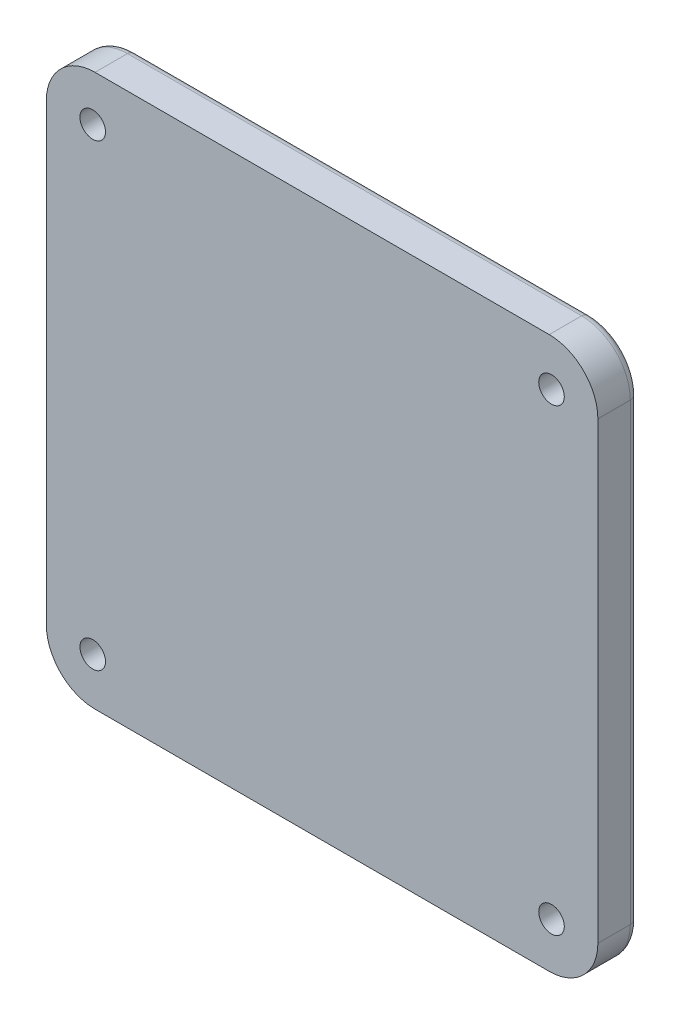
ISO-10303-21;
HEADER;
FILE_DESCRIPTION(('STEP AP214'),'2;1');
FILE_NAME('part.step','',(''),(''),'','','');
FILE_SCHEMA(('AUTOMOTIVE_DESIGN { 1 0 10303 214 1 1 1 1 }'));
ENDSEC;
DATA;
#1=APPLICATION_CONTEXT('core data for automotive mechanical design processes');
#2=APPLICATION_PROTOCOL_DEFINITION('international standard','automotive_design',2000,#1);
#3=PRODUCT_CONTEXT('',#1,'mechanical');
#4=PRODUCT('Part','Part','',(#3));
#5=PRODUCT_RELATED_PRODUCT_CATEGORY('part','',(#4));
#6=PRODUCT_DEFINITION_FORMATION('','',#4);
#7=PRODUCT_DEFINITION_CONTEXT('part definition',#1,'design');
#8=PRODUCT_DEFINITION('design','',#6,#7);
#9=PRODUCT_DEFINITION_SHAPE('','',#8);
#10=(LENGTH_UNIT() NAMED_UNIT(*) SI_UNIT(.MILLI.,.METRE.));
#11=(NAMED_UNIT(*) PLANE_ANGLE_UNIT() SI_UNIT($,.RADIAN.));
#12=(NAMED_UNIT(*) SI_UNIT($,.STERADIAN.) SOLID_ANGLE_UNIT());
#13=UNCERTAINTY_MEASURE_WITH_UNIT(LENGTH_MEASURE(1.E-05),#10,'distance_accuracy_value','');
#14=(GEOMETRIC_REPRESENTATION_CONTEXT(3) GLOBAL_UNCERTAINTY_ASSIGNED_CONTEXT((#13)) GLOBAL_UNIT_ASSIGNED_CONTEXT((#10,
#11,#12)) REPRESENTATION_CONTEXT('',''));
#15=CARTESIAN_POINT('',(0.,0.,0.));
#16=DIRECTION('',(0.,0.,1.));
#17=DIRECTION('',(1.,0.,0.));
#18=AXIS2_PLACEMENT_3D('',#15,#16,#17);
#19=CARTESIAN_POINT('',(117.072792821185,19.2587083204985,-102.507071392975));
#20=DIRECTION('',(0.,0.,1.));
#21=DIRECTION('',(1.,0.,0.));
#22=AXIS2_PLACEMENT_3D('',#19,#20,#21);
#23=PLANE('',#22);
#24=DIRECTION('',(1.,0.,0.));
#25=VECTOR('',#24,1.);
#26=CARTESIAN_POINT('',(117.072792821185,80.2587083204985,-102.507071392975));
#27=LINE('',#26,#25);
#28=CARTESIAN_POINT('',(61.0727928211846,80.2587083204985,-102.507071392975));
#29=VERTEX_POINT('',#28);
#30=CARTESIAN_POINT('',(117.072792821185,80.2587083204985,-102.507071392975));
#31=VERTEX_POINT('',#30);
#32=EDGE_CURVE('E197',#29,#31,#27,.T.);
#33=ORIENTED_EDGE('',*,*,#32,.T.);
#34=CARTESIAN_POINT('',(117.072792821185,75.2587083204985,-102.507071392975));
#35=DIRECTION('',(0.,0.,1.));
#36=DIRECTION('',(1.,0.,0.));
#37=AXIS2_PLACEMENT_3D('',#34,#35,#36);
#38=CIRCLE('',#37,5.);
#39=CARTESIAN_POINT('',(122.072792821185,75.2587083204985,-102.507071392975));
#40=VERTEX_POINT('',#39);
#41=EDGE_CURVE('E199',#31,#40,#38,.F.);
#42=ORIENTED_EDGE('',*,*,#41,.T.);
#43=DIRECTION('',(0.,-1.,0.));
#44=VECTOR('',#43,1.);
#45=CARTESIAN_POINT('',(122.072792821185,19.2587083204985,-102.507071392975));
#46=LINE('',#45,#44);
#47=CARTESIAN_POINT('',(122.072792821185,19.2587083204985,-102.507071392975));
#48=VERTEX_POINT('',#47);
#49=EDGE_CURVE('E136',#40,#48,#46,.T.);
#50=ORIENTED_EDGE('',*,*,#49,.T.);
#51=CARTESIAN_POINT('',(117.072792821185,19.2587083204985,-102.507071392975));
#52=DIRECTION('',(0.,0.,1.));
#53=DIRECTION('',(1.,0.,0.));
#54=AXIS2_PLACEMENT_3D('',#51,#52,#53);
#55=CIRCLE('',#54,5.);
#56=CARTESIAN_POINT('',(117.072792821185,14.2587083204985,-102.507071392975));
#57=VERTEX_POINT('',#56);
#58=EDGE_CURVE('E187',#48,#57,#55,.F.);
#59=ORIENTED_EDGE('',*,*,#58,.T.);
#60=DIRECTION('',(-1.,0.,0.));
#61=VECTOR('',#60,1.);
#62=CARTESIAN_POINT('',(117.072792821185,14.2587083204985,-102.507071392975));
#63=LINE('',#62,#61);
#64=CARTESIAN_POINT('',(61.0727928211846,14.2587083204985,-102.507071392975));
#65=VERTEX_POINT('',#64);
#66=EDGE_CURVE('E189',#57,#65,#63,.T.);
#67=ORIENTED_EDGE('',*,*,#66,.T.);
#68=CARTESIAN_POINT('',(61.0727928211845,19.2587083204985,-102.507071392975));
#69=DIRECTION('',(0.,0.,1.));
#70=DIRECTION('',(1.,0.,0.));
#71=AXIS2_PLACEMENT_3D('',#68,#69,#70);
#72=CIRCLE('',#71,5.);
#73=CARTESIAN_POINT('',(56.0727928211845,19.2587083204985,-102.507071392975));
#74=VERTEX_POINT('',#73);
#75=EDGE_CURVE('E191',#65,#74,#72,.F.);
#76=ORIENTED_EDGE('',*,*,#75,.T.);
#77=DIRECTION('',(0.,1.,0.));
#78=VECTOR('',#77,1.);
#79=CARTESIAN_POINT('',(56.0727928211845,19.2587083204985,-102.507071392975));
#80=LINE('',#79,#78);
#81=CARTESIAN_POINT('',(56.0727928211845,75.2587083204985,-102.507071392975));
#82=VERTEX_POINT('',#81);
#83=EDGE_CURVE('E193',#74,#82,#80,.T.);
#84=ORIENTED_EDGE('',*,*,#83,.T.);
#85=CARTESIAN_POINT('',(61.0727928211845,75.2587083204985,-102.507071392975));
#86=DIRECTION('',(0.,0.,1.));
#87=DIRECTION('',(1.,0.,0.));
#88=AXIS2_PLACEMENT_3D('',#85,#86,#87);
#89=CIRCLE('',#88,5.);
#90=EDGE_CURVE('E195',#82,#29,#89,.F.);
#91=ORIENTED_EDGE('',*,*,#90,.T.);
#92=EDGE_LOOP('',(#33,#42,#50,#59,#67,#76,#84,#91));
#93=FACE_BOUND('',#92,.T.);
#94=CARTESIAN_POINT('',(117.357064068646,75.5429795679604,-102.507071392975));
#95=DIRECTION('',(0.,0.,-1.));
#96=DIRECTION('',(-1.,0.,0.));
#97=AXIS2_PLACEMENT_3D('',#94,#95,#96);
#98=CIRCLE('',#97,1.57499999999999);
#99=CARTESIAN_POINT('',(115.782064068646,75.5429795679604,-102.507071392975));
#100=VERTEX_POINT('',#99);
#101=EDGE_CURVE('E152',#100,#100,#98,.T.);
#102=ORIENTED_EDGE('',*,*,#101,.F.);
#103=EDGE_LOOP('',(#102));
#104=FACE_BOUND('',#103,.T.);
#105=CARTESIAN_POINT('',(60.7885215737225,75.5429795679611,-102.507071392975));
#106=DIRECTION('',(0.,0.,-1.));
#107=DIRECTION('',(-1.,0.,0.));
#108=AXIS2_PLACEMENT_3D('',#105,#106,#107);
#109=CIRCLE('',#108,1.57499999999999);
#110=CARTESIAN_POINT('',(59.2135215737225,75.5429795679611,-102.507071392975));
#111=VERTEX_POINT('',#110);
#112=EDGE_CURVE('E256',#111,#111,#109,.T.);
#113=ORIENTED_EDGE('',*,*,#112,.F.);
#114=EDGE_LOOP('',(#113));
#115=FACE_BOUND('',#114,.T.);
#116=CARTESIAN_POINT('',(60.788521573722,18.9744370730372,-102.507071392975));
#117=DIRECTION('',(0.,0.,-1.));
#118=DIRECTION('',(-1.,0.,0.));
#119=AXIS2_PLACEMENT_3D('',#116,#117,#118);
#120=CIRCLE('',#119,1.57499999999999);
#121=CARTESIAN_POINT('',(59.213521573722,18.9744370730372,-102.507071392975));
#122=VERTEX_POINT('',#121);
#123=EDGE_CURVE('E250',#122,#122,#120,.T.);
#124=ORIENTED_EDGE('',*,*,#123,.F.);
#125=EDGE_LOOP('',(#124));
#126=FACE_BOUND('',#125,.T.);
#127=CARTESIAN_POINT('',(117.357064068646,18.9744370730369,-102.507071392975));
#128=DIRECTION('',(0.,0.,-1.));
#129=DIRECTION('',(-1.,0.,0.));
#130=AXIS2_PLACEMENT_3D('',#127,#128,#129);
#131=CIRCLE('',#130,1.57499999999998);
#132=CARTESIAN_POINT('',(115.782064068646,18.9744370730369,-102.507071392975));
#133=VERTEX_POINT('',#132);
#134=EDGE_CURVE('E242',#133,#133,#131,.T.);
#135=ORIENTED_EDGE('',*,*,#134,.F.);
#136=EDGE_LOOP('',(#135));
#137=FACE_BOUND('',#136,.T.);
#138=ADVANCED_FACE('F41',(#93,#104,#115,#126,#137),#23,.F.);
#139=CARTESIAN_POINT('',(117.072792821185,19.2587083204985,-97.507071392975));
#140=DIRECTION('',(0.,0.,1.));
#141=DIRECTION('',(1.,0.,0.));
#142=AXIS2_PLACEMENT_3D('',#139,#140,#141);
#143=PLANE('',#142);
#144=CARTESIAN_POINT('',(60.788521573722,18.9744370730372,-97.507071392975));
#145=DIRECTION('',(0.,0.,-1.));
#146=DIRECTION('',(-1.,0.,0.));
#147=AXIS2_PLACEMENT_3D('',#144,#145,#146);
#148=CIRCLE('',#147,1.57499999999999);
#149=CARTESIAN_POINT('',(59.213521573722,18.9744370730372,-97.507071392975));
#150=VERTEX_POINT('',#149);
#151=EDGE_CURVE('E247',#150,#150,#148,.T.);
#152=ORIENTED_EDGE('',*,*,#151,.T.);
#153=EDGE_LOOP('',(#152));
#154=FACE_BOUND('',#153,.T.);
#155=CARTESIAN_POINT('',(117.357064068646,75.5429795679604,-97.507071392975));
#156=DIRECTION('',(0.,0.,-1.));
#157=DIRECTION('',(-1.,0.,0.));
#158=AXIS2_PLACEMENT_3D('',#155,#156,#157);
#159=CIRCLE('',#158,1.57499999999999);
#160=CARTESIAN_POINT('',(115.782064068646,75.5429795679604,-97.507071392975));
#161=VERTEX_POINT('',#160);
#162=EDGE_CURVE('E155',#161,#161,#159,.T.);
#163=ORIENTED_EDGE('',*,*,#162,.T.);
#164=EDGE_LOOP('',(#163));
#165=FACE_BOUND('',#164,.T.);
#166=CARTESIAN_POINT('',(117.072792821185,19.2587083204985,-97.507071392975));
#167=DIRECTION('',(0.,0.,-1.));
#168=DIRECTION('',(1.,0.,0.));
#169=AXIS2_PLACEMENT_3D('',#166,#167,#168);
#170=CIRCLE('',#169,6.);
#171=CARTESIAN_POINT('',(123.072792821185,19.2587083204985,-97.507071392975));
#172=VERTEX_POINT('',#171);
#173=CARTESIAN_POINT('',(117.072792821185,13.2587083204985,-97.507071392975));
#174=VERTEX_POINT('',#173);
#175=EDGE_CURVE('E144',#172,#174,#170,.T.);
#176=ORIENTED_EDGE('',*,*,#175,.F.);
#177=DIRECTION('',(0.,-1.,0.));
#178=VECTOR('',#177,1.);
#179=CARTESIAN_POINT('',(123.072792821185,19.2587083204985,-97.507071392975));
#180=LINE('',#179,#178);
#181=CARTESIAN_POINT('',(123.072792821185,75.2587083204984,-97.507071392975));
#182=VERTEX_POINT('',#181);
#183=EDGE_CURVE('E172',#182,#172,#180,.T.);
#184=ORIENTED_EDGE('',*,*,#183,.F.);
#185=CARTESIAN_POINT('',(117.072792821185,75.2587083204985,-97.507071392975));
#186=DIRECTION('',(0.,0.,-1.));
#187=DIRECTION('',(-1.,0.,0.));
#188=AXIS2_PLACEMENT_3D('',#185,#186,#187);
#189=CIRCLE('',#188,6.);
#190=CARTESIAN_POINT('',(117.072792821185,81.2587083204985,-97.507071392975));
#191=VERTEX_POINT('',#190);
#192=EDGE_CURVE('E169',#191,#182,#189,.T.);
#193=ORIENTED_EDGE('',*,*,#192,.F.);
#194=DIRECTION('',(1.,0.,0.));
#195=VECTOR('',#194,1.);
#196=CARTESIAN_POINT('',(61.0727928211846,81.2587083204985,-97.507071392975));
#197=LINE('',#196,#195);
#198=CARTESIAN_POINT('',(61.0727928211846,81.2587083204985,-97.507071392975));
#199=VERTEX_POINT('',#198);
#200=EDGE_CURVE('E166',#199,#191,#197,.T.);
#201=ORIENTED_EDGE('',*,*,#200,.F.);
#202=CARTESIAN_POINT('',(61.0727928211845,75.2587083204985,-97.507071392975));
#203=DIRECTION('',(0.,0.,-1.));
#204=DIRECTION('',(-1.,0.,0.));
#205=AXIS2_PLACEMENT_3D('',#202,#203,#204);
#206=CIRCLE('',#205,6.);
#207=CARTESIAN_POINT('',(55.0727928211845,75.2587083204985,-97.507071392975));
#208=VERTEX_POINT('',#207);
#209=EDGE_CURVE('E163',#208,#199,#206,.T.);
#210=ORIENTED_EDGE('',*,*,#209,.F.);
#211=DIRECTION('',(0.,1.,0.));
#212=VECTOR('',#211,1.);
#213=CARTESIAN_POINT('',(55.0727928211845,19.2587083204985,-97.507071392975));
#214=LINE('',#213,#212);
#215=CARTESIAN_POINT('',(55.0727928211845,19.2587083204985,-97.507071392975));
#216=VERTEX_POINT('',#215);
#217=EDGE_CURVE('E160',#216,#208,#214,.T.);
#218=ORIENTED_EDGE('',*,*,#217,.F.);
#219=CARTESIAN_POINT('',(61.0727928211845,19.2587083204985,-97.507071392975));
#220=DIRECTION('',(0.,0.,-1.));
#221=DIRECTION('',(-1.,0.,0.));
#222=AXIS2_PLACEMENT_3D('',#219,#220,#221);
#223=CIRCLE('',#222,6.);
#224=CARTESIAN_POINT('',(61.0727928211846,13.2587083204985,-97.507071392975));
#225=VERTEX_POINT('',#224);
#226=EDGE_CURVE('E147',#225,#216,#223,.T.);
#227=ORIENTED_EDGE('',*,*,#226,.F.);
#228=DIRECTION('',(-1.,0.,0.));
#229=VECTOR('',#228,1.);
#230=CARTESIAN_POINT('',(61.0727928211846,13.2587083204985,-97.507071392975));
#231=LINE('',#230,#229);
#232=EDGE_CURVE('E132',#174,#225,#231,.T.);
#233=ORIENTED_EDGE('',*,*,#232,.F.);
#234=EDGE_LOOP('',(#176,#184,#193,#201,#210,#218,#227,#233));
#235=FACE_BOUND('',#234,.T.);
#236=CARTESIAN_POINT('',(60.7885215737225,75.5429795679611,-97.507071392975));
#237=DIRECTION('',(0.,0.,-1.));
#238=DIRECTION('',(-1.,0.,0.));
#239=AXIS2_PLACEMENT_3D('',#236,#237,#238);
#240=CIRCLE('',#239,1.57499999999999);
#241=CARTESIAN_POINT('',(59.2135215737225,75.5429795679611,-97.507071392975));
#242=VERTEX_POINT('',#241);
#243=EDGE_CURVE('E253',#242,#242,#240,.T.);
#244=ORIENTED_EDGE('',*,*,#243,.T.);
#245=EDGE_LOOP('',(#244));
#246=FACE_BOUND('',#245,.T.);
#247=CARTESIAN_POINT('',(117.357064068646,18.9744370730369,-97.507071392975));
#248=DIRECTION('',(0.,0.,-1.));
#249=DIRECTION('',(-1.,0.,0.));
#250=AXIS2_PLACEMENT_3D('',#247,#248,#249);
#251=CIRCLE('',#250,1.57499999999998);
#252=CARTESIAN_POINT('',(115.782064068646,18.9744370730369,-97.507071392975));
#253=VERTEX_POINT('',#252);
#254=EDGE_CURVE('E236',#253,#253,#251,.T.);
#255=ORIENTED_EDGE('',*,*,#254,.T.);
#256=EDGE_LOOP('',(#255));
#257=FACE_BOUND('',#256,.T.);
#258=ADVANCED_FACE('F141',(#154,#165,#235,#246,#257),#143,.T.);
#259=CARTESIAN_POINT('',(117.072792821185,19.2587083204985,-102.507071392975));
#260=DIRECTION('',(0.,0.,1.));
#261=DIRECTION('',(1.,0.,0.));
#262=AXIS2_PLACEMENT_3D('',#259,#260,#261);
#263=CYLINDRICAL_SURFACE('',#262,6.);
#264=DIRECTION('',(0.,0.,1.));
#265=VECTOR('',#264,1.);
#266=CARTESIAN_POINT('',(117.072792821185,13.2587083204985,-102.507071392975));
#267=LINE('',#266,#265);
#268=CARTESIAN_POINT('',(117.072792821185,13.2587083204985,-101.507071392975));
#269=VERTEX_POINT('',#268);
#270=EDGE_CURVE('E129',#269,#174,#267,.T.);
#271=ORIENTED_EDGE('',*,*,#270,.F.);
#272=CARTESIAN_POINT('',(117.072792821185,19.2587083204985,-101.507071392975));
#273=DIRECTION('',(0.,0.,1.));
#274=DIRECTION('',(1.,0.,0.));
#275=AXIS2_PLACEMENT_3D('',#272,#273,#274);
#276=CIRCLE('',#275,6.);
#277=CARTESIAN_POINT('',(123.072792821185,19.2587083204985,-101.507071392975));
#278=VERTEX_POINT('',#277);
#279=EDGE_CURVE('E50',#269,#278,#276,.T.);
#280=ORIENTED_EDGE('',*,*,#279,.T.);
#281=DIRECTION('',(0.,0.,1.));
#282=VECTOR('',#281,1.);
#283=CARTESIAN_POINT('',(123.072792821185,19.2587083204985,-102.507071392975));
#284=LINE('',#283,#282);
#285=EDGE_CURVE('E150',#278,#172,#284,.T.);
#286=ORIENTED_EDGE('',*,*,#285,.T.);
#287=ORIENTED_EDGE('',*,*,#175,.T.);
#288=EDGE_LOOP('',(#271,#280,#286,#287));
#289=FACE_BOUND('',#288,.T.);
#290=ADVANCED_FACE('F149',(#289),#263,.T.);
#291=CARTESIAN_POINT('',(61.0727928211846,13.2587083204985,-102.507071392975));
#292=DIRECTION('',(0.,1.,0.));
#293=DIRECTION('',(-1.,0.,0.));
#294=AXIS2_PLACEMENT_3D('',#291,#292,#293);
#295=PLANE('',#294);
#296=DIRECTION('',(0.,0.,1.));
#297=VECTOR('',#296,1.);
#298=CARTESIAN_POINT('',(61.0727928211846,13.2587083204985,-102.507071392975));
#299=LINE('',#298,#297);
#300=CARTESIAN_POINT('',(61.0727928211846,13.2587083204985,-101.507071392975));
#301=VERTEX_POINT('',#300);
#302=EDGE_CURVE('E137',#301,#225,#299,.T.);
#303=ORIENTED_EDGE('',*,*,#302,.F.);
#304=DIRECTION('',(-1.,0.,0.));
#305=VECTOR('',#304,1.);
#306=CARTESIAN_POINT('',(61.0727928211846,13.2587083204985,-101.507071392975));
#307=LINE('',#306,#305);
#308=EDGE_CURVE('E65',#301,#269,#307,.F.);
#309=ORIENTED_EDGE('',*,*,#308,.T.);
#310=ORIENTED_EDGE('',*,*,#270,.T.);
#311=ORIENTED_EDGE('',*,*,#232,.T.);
#312=EDGE_LOOP('',(#303,#309,#310,#311));
#313=FACE_BOUND('',#312,.T.);
#314=ADVANCED_FACE('F131',(#313),#295,.F.);
#315=CARTESIAN_POINT('',(61.0727928211845,19.2587083204985,-102.507071392975));
#316=DIRECTION('',(0.,0.,1.));
#317=DIRECTION('',(1.,0.,0.));
#318=AXIS2_PLACEMENT_3D('',#315,#316,#317);
#319=CYLINDRICAL_SURFACE('',#318,6.);
#320=DIRECTION('',(0.,0.,1.));
#321=VECTOR('',#320,1.);
#322=CARTESIAN_POINT('',(55.0727928211845,19.2587083204985,-102.507071392975));
#323=LINE('',#322,#321);
#324=CARTESIAN_POINT('',(55.0727928211845,19.2587083204985,-101.507071392975));
#325=VERTEX_POINT('',#324);
#326=EDGE_CURVE('E183',#325,#216,#323,.T.);
#327=ORIENTED_EDGE('',*,*,#326,.F.);
#328=CARTESIAN_POINT('',(61.0727928211845,19.2587083204985,-101.507071392975));
#329=DIRECTION('',(0.,0.,1.));
#330=DIRECTION('',(1.,0.,0.));
#331=AXIS2_PLACEMENT_3D('',#328,#329,#330);
#332=CIRCLE('',#331,6.);
#333=EDGE_CURVE('E211',#325,#301,#332,.T.);
#334=ORIENTED_EDGE('',*,*,#333,.T.);
#335=ORIENTED_EDGE('',*,*,#302,.T.);
#336=ORIENTED_EDGE('',*,*,#226,.T.);
#337=EDGE_LOOP('',(#327,#334,#335,#336));
#338=FACE_BOUND('',#337,.T.);
#339=ADVANCED_FACE('F308',(#338),#319,.T.);
#340=CARTESIAN_POINT('',(55.0727928211845,19.2587083204985,-102.507071392975));
#341=DIRECTION('',(1.,0.,0.));
#342=DIRECTION('',(0.,0.,-1.));
#343=AXIS2_PLACEMENT_3D('',#340,#341,#342);
#344=PLANE('',#343);
#345=DIRECTION('',(0.,0.,1.));
#346=VECTOR('',#345,1.);
#347=CARTESIAN_POINT('',(55.0727928211845,75.2587083204985,-102.507071392975));
#348=LINE('',#347,#346);
#349=CARTESIAN_POINT('',(55.0727928211845,75.2587083204985,-101.507071392975));
#350=VERTEX_POINT('',#349);
#351=EDGE_CURVE('E181',#350,#208,#348,.T.);
#352=ORIENTED_EDGE('',*,*,#351,.F.);
#353=DIRECTION('',(0.,1.,0.));
#354=VECTOR('',#353,1.);
#355=CARTESIAN_POINT('',(55.0727928211845,19.2587083204985,-101.507071392975));
#356=LINE('',#355,#354);
#357=EDGE_CURVE('E209',#350,#325,#356,.F.);
#358=ORIENTED_EDGE('',*,*,#357,.T.);
#359=ORIENTED_EDGE('',*,*,#326,.T.);
#360=ORIENTED_EDGE('',*,*,#217,.T.);
#361=EDGE_LOOP('',(#352,#358,#359,#360));
#362=FACE_BOUND('',#361,.T.);
#363=ADVANCED_FACE('F304',(#362),#344,.F.);
#364=CARTESIAN_POINT('',(61.0727928211845,75.2587083204985,-102.507071392975));
#365=DIRECTION('',(0.,0.,1.));
#366=DIRECTION('',(1.,0.,0.));
#367=AXIS2_PLACEMENT_3D('',#364,#365,#366);
#368=CYLINDRICAL_SURFACE('',#367,6.);
#369=DIRECTION('',(0.,0.,1.));
#370=VECTOR('',#369,1.);
#371=CARTESIAN_POINT('',(61.0727928211846,81.2587083204985,-102.507071392975));
#372=LINE('',#371,#370);
#373=CARTESIAN_POINT('',(61.0727928211846,81.2587083204985,-101.507071392975));
#374=VERTEX_POINT('',#373);
#375=EDGE_CURVE('E179',#374,#199,#372,.T.);
#376=ORIENTED_EDGE('',*,*,#375,.F.);
#377=CARTESIAN_POINT('',(61.0727928211845,75.2587083204985,-101.507071392975));
#378=DIRECTION('',(0.,0.,1.));
#379=DIRECTION('',(1.,0.,0.));
#380=AXIS2_PLACEMENT_3D('',#377,#378,#379);
#381=CIRCLE('',#380,6.);
#382=EDGE_CURVE('E207',#374,#350,#381,.T.);
#383=ORIENTED_EDGE('',*,*,#382,.T.);
#384=ORIENTED_EDGE('',*,*,#351,.T.);
#385=ORIENTED_EDGE('',*,*,#209,.T.);
#386=EDGE_LOOP('',(#376,#383,#384,#385));
#387=FACE_BOUND('',#386,.T.);
#388=ADVANCED_FACE('F300',(#387),#368,.T.);
#389=CARTESIAN_POINT('',(61.0727928211846,81.2587083204985,-102.507071392975));
#390=DIRECTION('',(0.,-1.,0.));
#391=DIRECTION('',(1.,0.,0.));
#392=AXIS2_PLACEMENT_3D('',#389,#390,#391);
#393=PLANE('',#392);
#394=DIRECTION('',(0.,0.,1.));
#395=VECTOR('',#394,1.);
#396=CARTESIAN_POINT('',(117.072792821185,81.2587083204985,-102.507071392975));
#397=LINE('',#396,#395);
#398=CARTESIAN_POINT('',(117.072792821185,81.2587083204985,-101.507071392975));
#399=VERTEX_POINT('',#398);
#400=EDGE_CURVE('E177',#399,#191,#397,.T.);
#401=ORIENTED_EDGE('',*,*,#400,.F.);
#402=DIRECTION('',(1.,0.,0.));
#403=VECTOR('',#402,1.);
#404=CARTESIAN_POINT('',(61.0727928211846,81.2587083204985,-101.507071392975));
#405=LINE('',#404,#403);
#406=EDGE_CURVE('E205',#399,#374,#405,.F.);
#407=ORIENTED_EDGE('',*,*,#406,.T.);
#408=ORIENTED_EDGE('',*,*,#375,.T.);
#409=ORIENTED_EDGE('',*,*,#200,.T.);
#410=EDGE_LOOP('',(#401,#407,#408,#409));
#411=FACE_BOUND('',#410,.T.);
#412=ADVANCED_FACE('F296',(#411),#393,.F.);
#413=CARTESIAN_POINT('',(117.072792821185,75.2587083204985,-102.507071392975));
#414=DIRECTION('',(0.,0.,1.));
#415=DIRECTION('',(1.,0.,0.));
#416=AXIS2_PLACEMENT_3D('',#413,#414,#415);
#417=CYLINDRICAL_SURFACE('',#416,6.);
#418=DIRECTION('',(0.,0.,1.));
#419=VECTOR('',#418,1.);
#420=CARTESIAN_POINT('',(123.072792821185,75.2587083204984,-102.507071392975));
#421=LINE('',#420,#419);
#422=CARTESIAN_POINT('',(123.072792821185,75.2587083204984,-101.507071392975));
#423=VERTEX_POINT('',#422);
#424=EDGE_CURVE('E175',#423,#182,#421,.T.);
#425=ORIENTED_EDGE('',*,*,#424,.F.);
#426=CARTESIAN_POINT('',(117.072792821185,75.2587083204985,-101.507071392975));
#427=DIRECTION('',(0.,0.,1.));
#428=DIRECTION('',(1.,0.,0.));
#429=AXIS2_PLACEMENT_3D('',#426,#427,#428);
#430=CIRCLE('',#429,6.);
#431=EDGE_CURVE('E202',#423,#399,#430,.T.);
#432=ORIENTED_EDGE('',*,*,#431,.T.);
#433=ORIENTED_EDGE('',*,*,#400,.T.);
#434=ORIENTED_EDGE('',*,*,#192,.T.);
#435=EDGE_LOOP('',(#425,#432,#433,#434));
#436=FACE_BOUND('',#435,.T.);
#437=ADVANCED_FACE('F292',(#436),#417,.T.);
#438=CARTESIAN_POINT('',(123.072792821185,19.2587083204985,-102.507071392975));
#439=DIRECTION('',(-1.,0.,0.));
#440=DIRECTION('',(0.,0.,1.));
#441=AXIS2_PLACEMENT_3D('',#438,#439,#440);
#442=PLANE('',#441);
#443=ORIENTED_EDGE('',*,*,#285,.F.);
#444=DIRECTION('',(0.,-1.,0.));
#445=VECTOR('',#444,1.);
#446=CARTESIAN_POINT('',(123.072792821185,19.2587083204985,-101.507071392975));
#447=LINE('',#446,#445);
#448=EDGE_CURVE('E11',#278,#423,#447,.F.);
#449=ORIENTED_EDGE('',*,*,#448,.T.);
#450=ORIENTED_EDGE('',*,*,#424,.T.);
#451=ORIENTED_EDGE('',*,*,#183,.T.);
#452=EDGE_LOOP('',(#443,#449,#450,#451));
#453=FACE_BOUND('',#452,.T.);
#454=ADVANCED_FACE('F275',(#453),#442,.F.);
#455=CARTESIAN_POINT('',(117.357064068646,75.5429795679604,-102.507071392975));
#456=DIRECTION('',(0.,0.,1.));
#457=DIRECTION('',(1.,0.,0.));
#458=AXIS2_PLACEMENT_3D('',#455,#456,#457);
#459=CYLINDRICAL_SURFACE('',#458,1.57499999999999);
#460=ORIENTED_EDGE('',*,*,#101,.T.);
#461=EDGE_LOOP('',(#460));
#462=FACE_BOUND('',#461,.T.);
#463=ORIENTED_EDGE('',*,*,#162,.F.);
#464=EDGE_LOOP('',(#463));
#465=FACE_BOUND('',#464,.T.);
#466=ADVANCED_FACE('F265',(#462,#465),#459,.F.);
#467=CARTESIAN_POINT('',(60.7885215737225,75.5429795679611,-102.507071392975));
#468=DIRECTION('',(0.,0.,1.));
#469=DIRECTION('',(1.,0.,0.));
#470=AXIS2_PLACEMENT_3D('',#467,#468,#469);
#471=CYLINDRICAL_SURFACE('',#470,1.57499999999999);
#472=ORIENTED_EDGE('',*,*,#112,.T.);
#473=EDGE_LOOP('',(#472));
#474=FACE_BOUND('',#473,.T.);
#475=ORIENTED_EDGE('',*,*,#243,.F.);
#476=EDGE_LOOP('',(#475));
#477=FACE_BOUND('',#476,.T.);
#478=ADVANCED_FACE('F262',(#474,#477),#471,.F.);
#479=CARTESIAN_POINT('',(60.788521573722,18.9744370730372,-102.507071392975));
#480=DIRECTION('',(0.,0.,1.));
#481=DIRECTION('',(1.,0.,0.));
#482=AXIS2_PLACEMENT_3D('',#479,#480,#481);
#483=CYLINDRICAL_SURFACE('',#482,1.57499999999999);
#484=ORIENTED_EDGE('',*,*,#123,.T.);
#485=EDGE_LOOP('',(#484));
#486=FACE_BOUND('',#485,.T.);
#487=ORIENTED_EDGE('',*,*,#151,.F.);
#488=EDGE_LOOP('',(#487));
#489=FACE_BOUND('',#488,.T.);
#490=ADVANCED_FACE('F264',(#486,#489),#483,.F.);
#491=CARTESIAN_POINT('',(117.357064068646,18.9744370730369,-102.507071392975));
#492=DIRECTION('',(0.,0.,1.));
#493=DIRECTION('',(1.,0.,0.));
#494=AXIS2_PLACEMENT_3D('',#491,#492,#493);
#495=CYLINDRICAL_SURFACE('',#494,1.57499999999998);
#496=ORIENTED_EDGE('',*,*,#134,.T.);
#497=EDGE_LOOP('',(#496));
#498=FACE_BOUND('',#497,.T.);
#499=ORIENTED_EDGE('',*,*,#254,.F.);
#500=EDGE_LOOP('',(#499));
#501=FACE_BOUND('',#500,.T.);
#502=ADVANCED_FACE('F272',(#498,#501),#495,.F.);
#503=CARTESIAN_POINT('',(61.0727928211845,19.2587083204985,-101.507071392975));
#504=DIRECTION('',(0.,0.,1.));
#505=DIRECTION('',(1.,0.,0.));
#506=AXIS2_PLACEMENT_3D('',#503,#504,#505);
#507=TOROIDAL_SURFACE('',#506,5.,1.);
#508=CARTESIAN_POINT('',(61.0727928211846,14.2587083204985,-101.507071392975));
#509=DIRECTION('',(1.,0.,0.));
#510=DIRECTION('',(0.,1.,0.));
#511=AXIS2_PLACEMENT_3D('',#508,#509,#510);
#512=CIRCLE('',#511,1.);
#513=EDGE_CURVE('E230',#301,#65,#512,.T.);
#514=ORIENTED_EDGE('',*,*,#513,.F.);
#515=ORIENTED_EDGE('',*,*,#333,.F.);
#516=CARTESIAN_POINT('',(56.0727928211845,19.2587083204985,-101.507071392975));
#517=DIRECTION('',(0.,1.,0.));
#518=DIRECTION('',(0.,0.,1.));
#519=AXIS2_PLACEMENT_3D('',#516,#517,#518);
#520=CIRCLE('',#519,1.);
#521=EDGE_CURVE('E45',#74,#325,#520,.T.);
#522=ORIENTED_EDGE('',*,*,#521,.F.);
#523=ORIENTED_EDGE('',*,*,#75,.F.);
#524=EDGE_LOOP('',(#514,#515,#522,#523));
#525=FACE_BOUND('',#524,.T.);
#526=ADVANCED_FACE('F43',(#525),#507,.T.);
#527=CARTESIAN_POINT('',(56.0727928211845,19.2587083204985,-101.507071392975));
#528=DIRECTION('',(0.,1.,0.));
#529=DIRECTION('',(0.,0.,1.));
#530=AXIS2_PLACEMENT_3D('',#527,#528,#529);
#531=CYLINDRICAL_SURFACE('',#530,1.);
#532=ORIENTED_EDGE('',*,*,#521,.T.);
#533=ORIENTED_EDGE('',*,*,#357,.F.);
#534=CARTESIAN_POINT('',(56.0727928211845,75.2587083204985,-101.507071392975));
#535=DIRECTION('',(0.,1.,0.));
#536=DIRECTION('',(-1.,0.,0.));
#537=AXIS2_PLACEMENT_3D('',#534,#535,#536);
#538=CIRCLE('',#537,1.);
#539=EDGE_CURVE('E228',#82,#350,#538,.T.);
#540=ORIENTED_EDGE('',*,*,#539,.F.);
#541=ORIENTED_EDGE('',*,*,#83,.F.);
#542=EDGE_LOOP('',(#532,#533,#540,#541));
#543=FACE_BOUND('',#542,.T.);
#544=ADVANCED_FACE('F338',(#543),#531,.T.);
#545=CARTESIAN_POINT('',(117.072792821185,14.2587083204985,-101.507071392975));
#546=DIRECTION('',(-1.,0.,0.));
#547=DIRECTION('',(0.,-1.,0.));
#548=AXIS2_PLACEMENT_3D('',#545,#546,#547);
#549=CYLINDRICAL_SURFACE('',#548,1.);
#550=ORIENTED_EDGE('',*,*,#513,.T.);
#551=ORIENTED_EDGE('',*,*,#66,.F.);
#552=CARTESIAN_POINT('',(117.072792821185,14.2587083204985,-101.507071392975));
#553=DIRECTION('',(1.,0.,0.));
#554=DIRECTION('',(0.,0.,-1.));
#555=AXIS2_PLACEMENT_3D('',#552,#553,#554);
#556=CIRCLE('',#555,1.);
#557=EDGE_CURVE('E225',#269,#57,#556,.T.);
#558=ORIENTED_EDGE('',*,*,#557,.F.);
#559=ORIENTED_EDGE('',*,*,#308,.F.);
#560=EDGE_LOOP('',(#550,#551,#558,#559));
#561=FACE_BOUND('',#560,.T.);
#562=ADVANCED_FACE('F335',(#561),#549,.T.);
#563=CARTESIAN_POINT('',(61.0727928211845,75.2587083204985,-101.507071392975));
#564=DIRECTION('',(0.,0.,1.));
#565=DIRECTION('',(1.,0.,0.));
#566=AXIS2_PLACEMENT_3D('',#563,#564,#565);
#567=TOROIDAL_SURFACE('',#566,5.,1.);
#568=ORIENTED_EDGE('',*,*,#539,.T.);
#569=ORIENTED_EDGE('',*,*,#382,.F.);
#570=CARTESIAN_POINT('',(61.0727928211846,80.2587083204985,-101.507071392975));
#571=DIRECTION('',(1.,0.,0.));
#572=DIRECTION('',(0.,0.,-1.));
#573=AXIS2_PLACEMENT_3D('',#570,#571,#572);
#574=CIRCLE('',#573,1.);
#575=EDGE_CURVE('E222',#29,#374,#574,.T.);
#576=ORIENTED_EDGE('',*,*,#575,.F.);
#577=ORIENTED_EDGE('',*,*,#90,.F.);
#578=EDGE_LOOP('',(#568,#569,#576,#577));
#579=FACE_BOUND('',#578,.T.);
#580=ADVANCED_FACE('F331',(#579),#567,.T.);
#581=CARTESIAN_POINT('',(117.072792821185,19.2587083204985,-101.507071392975));
#582=DIRECTION('',(0.,0.,1.));
#583=DIRECTION('',(1.,0.,0.));
#584=AXIS2_PLACEMENT_3D('',#581,#582,#583);
#585=TOROIDAL_SURFACE('',#584,5.,1.);
#586=ORIENTED_EDGE('',*,*,#557,.T.);
#587=ORIENTED_EDGE('',*,*,#58,.F.);
#588=CARTESIAN_POINT('',(122.072792821185,19.2587083204985,-101.507071392975));
#589=DIRECTION('',(0.,1.,0.));
#590=DIRECTION('',(-1.,0.,0.));
#591=AXIS2_PLACEMENT_3D('',#588,#589,#590);
#592=CIRCLE('',#591,1.);
#593=EDGE_CURVE('E219',#278,#48,#592,.T.);
#594=ORIENTED_EDGE('',*,*,#593,.F.);
#595=ORIENTED_EDGE('',*,*,#279,.F.);
#596=EDGE_LOOP('',(#586,#587,#594,#595));
#597=FACE_BOUND('',#596,.T.);
#598=ADVANCED_FACE('F327',(#597),#585,.T.);
#599=CARTESIAN_POINT('',(117.072792821185,80.2587083204985,-101.507071392975));
#600=DIRECTION('',(1.,0.,0.));
#601=DIRECTION('',(0.,1.,0.));
#602=AXIS2_PLACEMENT_3D('',#599,#600,#601);
#603=CYLINDRICAL_SURFACE('',#602,1.);
#604=ORIENTED_EDGE('',*,*,#575,.T.);
#605=ORIENTED_EDGE('',*,*,#406,.F.);
#606=CARTESIAN_POINT('',(117.072792821185,80.2587083204985,-101.507071392975));
#607=DIRECTION('',(1.,0.,0.));
#608=DIRECTION('',(0.,1.,0.));
#609=AXIS2_PLACEMENT_3D('',#606,#607,#608);
#610=CIRCLE('',#609,1.);
#611=EDGE_CURVE('E217',#31,#399,#610,.T.);
#612=ORIENTED_EDGE('',*,*,#611,.F.);
#613=ORIENTED_EDGE('',*,*,#32,.F.);
#614=EDGE_LOOP('',(#604,#605,#612,#613));
#615=FACE_BOUND('',#614,.T.);
#616=ADVANCED_FACE('F323',(#615),#603,.T.);
#617=CARTESIAN_POINT('',(122.072792821185,19.2587083204985,-101.507071392975));
#618=DIRECTION('',(0.,-1.,0.));
#619=DIRECTION('',(0.,0.,-1.));
#620=AXIS2_PLACEMENT_3D('',#617,#618,#619);
#621=CYLINDRICAL_SURFACE('',#620,1.);
#622=ORIENTED_EDGE('',*,*,#593,.T.);
#623=ORIENTED_EDGE('',*,*,#49,.F.);
#624=CARTESIAN_POINT('',(122.072792821185,75.2587083204984,-101.507071392975));
#625=DIRECTION('',(0.,1.,0.));
#626=DIRECTION('',(0.,0.,1.));
#627=AXIS2_PLACEMENT_3D('',#624,#625,#626);
#628=CIRCLE('',#627,1.);
#629=EDGE_CURVE('E215',#423,#40,#628,.T.);
#630=ORIENTED_EDGE('',*,*,#629,.F.);
#631=ORIENTED_EDGE('',*,*,#448,.F.);
#632=EDGE_LOOP('',(#622,#623,#630,#631));
#633=FACE_BOUND('',#632,.T.);
#634=ADVANCED_FACE('F319',(#633),#621,.T.);
#635=CARTESIAN_POINT('',(117.072792821185,75.2587083204985,-101.507071392975));
#636=DIRECTION('',(0.,0.,1.));
#637=DIRECTION('',(1.,0.,0.));
#638=AXIS2_PLACEMENT_3D('',#635,#636,#637);
#639=TOROIDAL_SURFACE('',#638,5.,1.);
#640=ORIENTED_EDGE('',*,*,#611,.T.);
#641=ORIENTED_EDGE('',*,*,#431,.F.);
#642=ORIENTED_EDGE('',*,*,#629,.T.);
#643=ORIENTED_EDGE('',*,*,#41,.F.);
#644=EDGE_LOOP('',(#640,#641,#642,#643));
#645=FACE_BOUND('',#644,.T.);
#646=ADVANCED_FACE('F316',(#645),#639,.T.);
#647=CLOSED_SHELL('',(#138,#258,#290,#314,#339,#363,#388,#412,#437,#454,#466,#478,#490,#502,
#526,#544,#562,#580,#598,#616,#634,#646));
#648=MANIFOLD_SOLID_BREP('B2',#647);
#649=ADVANCED_BREP_SHAPE_REPRESENTATION('',(#18,#648),#14);
#650=SHAPE_DEFINITION_REPRESENTATION(#9,#649);
ENDSEC;
END-ISO-10303-21;
